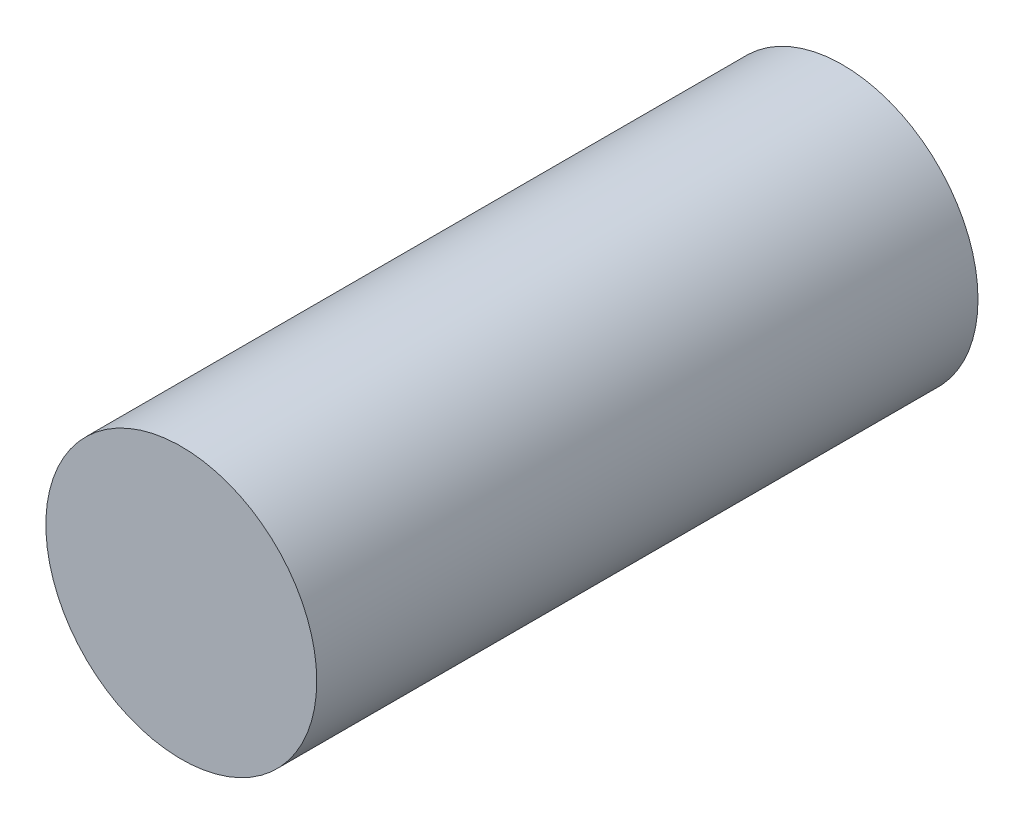
ISO-10303-21;
HEADER;
FILE_DESCRIPTION(('STEP AP214'),'2;1');
FILE_NAME('part.step','',(''),(''),'','','');
FILE_SCHEMA(('AUTOMOTIVE_DESIGN { 1 0 10303 214 1 1 1 1 }'));
ENDSEC;
DATA;
#1=APPLICATION_CONTEXT('core data for automotive mechanical design processes');
#2=APPLICATION_PROTOCOL_DEFINITION('international standard','automotive_design',2000,#1);
#3=PRODUCT_CONTEXT('',#1,'mechanical');
#4=PRODUCT('Part','Part','',(#3));
#5=PRODUCT_RELATED_PRODUCT_CATEGORY('part','',(#4));
#6=PRODUCT_DEFINITION_FORMATION('','',#4);
#7=PRODUCT_DEFINITION_CONTEXT('part definition',#1,'design');
#8=PRODUCT_DEFINITION('design','',#6,#7);
#9=PRODUCT_DEFINITION_SHAPE('','',#8);
#10=(LENGTH_UNIT() NAMED_UNIT(*) SI_UNIT(.MILLI.,.METRE.));
#11=(NAMED_UNIT(*) PLANE_ANGLE_UNIT() SI_UNIT($,.RADIAN.));
#12=(NAMED_UNIT(*) SI_UNIT($,.STERADIAN.) SOLID_ANGLE_UNIT());
#13=UNCERTAINTY_MEASURE_WITH_UNIT(LENGTH_MEASURE(1.E-05),#10,'distance_accuracy_value','');
#14=(GEOMETRIC_REPRESENTATION_CONTEXT(3) GLOBAL_UNCERTAINTY_ASSIGNED_CONTEXT((#13)) GLOBAL_UNIT_ASSIGNED_CONTEXT((#10,
#11,#12)) REPRESENTATION_CONTEXT('',''));
#15=CARTESIAN_POINT('',(0.,0.,0.));
#16=DIRECTION('',(0.,0.,1.));
#17=DIRECTION('',(1.,0.,0.));
#18=AXIS2_PLACEMENT_3D('',#15,#16,#17);
#19=CARTESIAN_POINT('',(0.,0.,5906.114982768));
#20=DIRECTION('',(0.,0.,-1.));
#21=DIRECTION('',(-1.,0.,0.));
#22=AXIS2_PLACEMENT_3D('',#19,#20,#21);
#23=CYLINDRICAL_SURFACE('',#22,1209.806435856);
#24=CARTESIAN_POINT('',(0.,0.,5906.114982768));
#25=DIRECTION('',(0.,0.,1.));
#26=DIRECTION('',(1.,0.,0.));
#27=AXIS2_PLACEMENT_3D('',#24,#25,#26);
#28=CIRCLE('',#27,1209.806435856);
#29=CARTESIAN_POINT('',(1209.806435856,0.,5906.114982768));
#30=VERTEX_POINT('',#29);
#31=EDGE_CURVE('E10',#30,#30,#28,.T.);
#32=ORIENTED_EDGE('',*,*,#31,.F.);
#33=EDGE_LOOP('',(#32));
#34=FACE_BOUND('',#33,.T.);
#35=CARTESIAN_POINT('',(0.,0.,0.));
#36=DIRECTION('',(0.,0.,1.));
#37=DIRECTION('',(1.,0.,0.));
#38=AXIS2_PLACEMENT_3D('',#35,#36,#37);
#39=CIRCLE('',#38,1209.806435856);
#40=CARTESIAN_POINT('',(1209.806435856,0.,0.));
#41=VERTEX_POINT('',#40);
#42=EDGE_CURVE('E38',#41,#41,#39,.T.);
#43=ORIENTED_EDGE('',*,*,#42,.T.);
#44=EDGE_LOOP('',(#43));
#45=FACE_BOUND('',#44,.T.);
#46=ADVANCED_FACE('F35',(#34,#45),#23,.T.);
#47=CARTESIAN_POINT('',(0.,0.,5906.114982768));
#48=DIRECTION('',(0.,0.,1.));
#49=DIRECTION('',(1.,0.,0.));
#50=AXIS2_PLACEMENT_3D('',#47,#48,#49);
#51=PLANE('',#50);
#52=ORIENTED_EDGE('',*,*,#31,.T.);
#53=EDGE_LOOP('',(#52));
#54=FACE_BOUND('',#53,.T.);
#55=ADVANCED_FACE('F50',(#54),#51,.T.);
#56=CARTESIAN_POINT('',(0.,0.,0.));
#57=DIRECTION('',(0.,0.,1.));
#58=DIRECTION('',(1.,0.,0.));
#59=AXIS2_PLACEMENT_3D('',#56,#57,#58);
#60=PLANE('',#59);
#61=ORIENTED_EDGE('',*,*,#42,.F.);
#62=EDGE_LOOP('',(#61));
#63=FACE_BOUND('',#62,.T.);
#64=ADVANCED_FACE('F48',(#63),#60,.F.);
#65=CLOSED_SHELL('',(#46,#55,#64));
#66=MANIFOLD_SOLID_BREP('B2',#65);
#67=ADVANCED_BREP_SHAPE_REPRESENTATION('',(#18,#66),#14);
#68=SHAPE_DEFINITION_REPRESENTATION(#9,#67);
ENDSEC;
END-ISO-10303-21;
